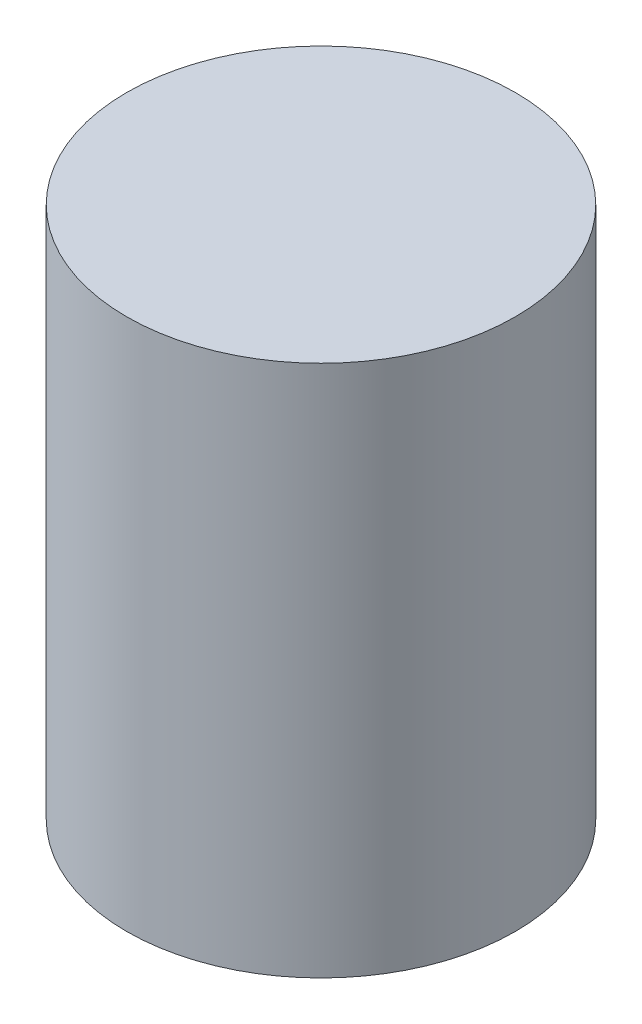
ISO-10303-21;
HEADER;
FILE_DESCRIPTION(('STEP AP214'),'2;1');
FILE_NAME('part.step','',(''),(''),'','','');
FILE_SCHEMA(('AUTOMOTIVE_DESIGN { 1 0 10303 214 1 1 1 1 }'));
ENDSEC;
DATA;
#1=APPLICATION_CONTEXT('core data for automotive mechanical design processes');
#2=APPLICATION_PROTOCOL_DEFINITION('international standard','automotive_design',2000,#1);
#3=PRODUCT_CONTEXT('',#1,'mechanical');
#4=PRODUCT('Part','Part','',(#3));
#5=PRODUCT_RELATED_PRODUCT_CATEGORY('part','',(#4));
#6=PRODUCT_DEFINITION_FORMATION('','',#4);
#7=PRODUCT_DEFINITION_CONTEXT('part definition',#1,'design');
#8=PRODUCT_DEFINITION('design','',#6,#7);
#9=PRODUCT_DEFINITION_SHAPE('','',#8);
#10=(LENGTH_UNIT() NAMED_UNIT(*) SI_UNIT(.MILLI.,.METRE.));
#11=(NAMED_UNIT(*) PLANE_ANGLE_UNIT() SI_UNIT($,.RADIAN.));
#12=(NAMED_UNIT(*) SI_UNIT($,.STERADIAN.) SOLID_ANGLE_UNIT());
#13=UNCERTAINTY_MEASURE_WITH_UNIT(LENGTH_MEASURE(1.E-05),#10,'distance_accuracy_value','');
#14=(GEOMETRIC_REPRESENTATION_CONTEXT(3) GLOBAL_UNCERTAINTY_ASSIGNED_CONTEXT((#13)) GLOBAL_UNIT_ASSIGNED_CONTEXT((#10,
#11,#12)) REPRESENTATION_CONTEXT('',''));
#15=CARTESIAN_POINT('',(0.,0.,0.));
#16=DIRECTION('',(0.,0.,1.));
#17=DIRECTION('',(1.,0.,0.));
#18=AXIS2_PLACEMENT_3D('',#15,#16,#17);
#19=CARTESIAN_POINT('',(0.,2.74,0.));
#20=DIRECTION('',(0.,-1.,0.));
#21=DIRECTION('',(0.,0.,-1.));
#22=AXIS2_PLACEMENT_3D('',#19,#20,#21);
#23=CYLINDRICAL_SURFACE('',#22,1.);
#24=CARTESIAN_POINT('',(0.,2.74,0.));
#25=DIRECTION('',(0.,1.,0.));
#26=DIRECTION('',(0.,0.,1.));
#27=AXIS2_PLACEMENT_3D('',#24,#25,#26);
#28=CIRCLE('',#27,1.);
#29=CARTESIAN_POINT('',(0.,2.74,1.));
#30=VERTEX_POINT('',#29);
#31=EDGE_CURVE('E10',#30,#30,#28,.T.);
#32=ORIENTED_EDGE('',*,*,#31,.F.);
#33=EDGE_LOOP('',(#32));
#34=FACE_BOUND('',#33,.T.);
#35=CARTESIAN_POINT('',(0.,0.,0.));
#36=DIRECTION('',(0.,1.,0.));
#37=DIRECTION('',(0.,0.,1.));
#38=AXIS2_PLACEMENT_3D('',#35,#36,#37);
#39=CIRCLE('',#38,1.);
#40=CARTESIAN_POINT('',(0.,0.,1.));
#41=VERTEX_POINT('',#40);
#42=EDGE_CURVE('E46',#41,#41,#39,.T.);
#43=ORIENTED_EDGE('',*,*,#42,.T.);
#44=EDGE_LOOP('',(#43));
#45=FACE_BOUND('',#44,.T.);
#46=ADVANCED_FACE('F43',(#34,#45),#23,.T.);
#47=CARTESIAN_POINT('',(0.,2.74,0.));
#48=DIRECTION('',(0.,1.,0.));
#49=DIRECTION('',(0.,0.,1.));
#50=AXIS2_PLACEMENT_3D('',#47,#48,#49);
#51=PLANE('',#50);
#52=ORIENTED_EDGE('',*,*,#31,.T.);
#53=EDGE_LOOP('',(#52));
#54=FACE_BOUND('',#53,.T.);
#55=ADVANCED_FACE('F60',(#54),#51,.T.);
#56=CARTESIAN_POINT('',(0.,0.,0.));
#57=DIRECTION('',(0.,1.,0.));
#58=DIRECTION('',(0.,0.,1.));
#59=AXIS2_PLACEMENT_3D('',#56,#57,#58);
#60=PLANE('',#59);
#61=ORIENTED_EDGE('',*,*,#42,.F.);
#62=EDGE_LOOP('',(#61));
#63=FACE_BOUND('',#62,.T.);
#64=ADVANCED_FACE('F58',(#63),#60,.F.);
#65=CLOSED_SHELL('',(#46,#55,#64));
#66=MANIFOLD_SOLID_BREP('B2',#65);
#67=ADVANCED_BREP_SHAPE_REPRESENTATION('',(#18,#66),#14);
#68=SHAPE_DEFINITION_REPRESENTATION(#9,#67);
ENDSEC;
END-ISO-10303-21;
